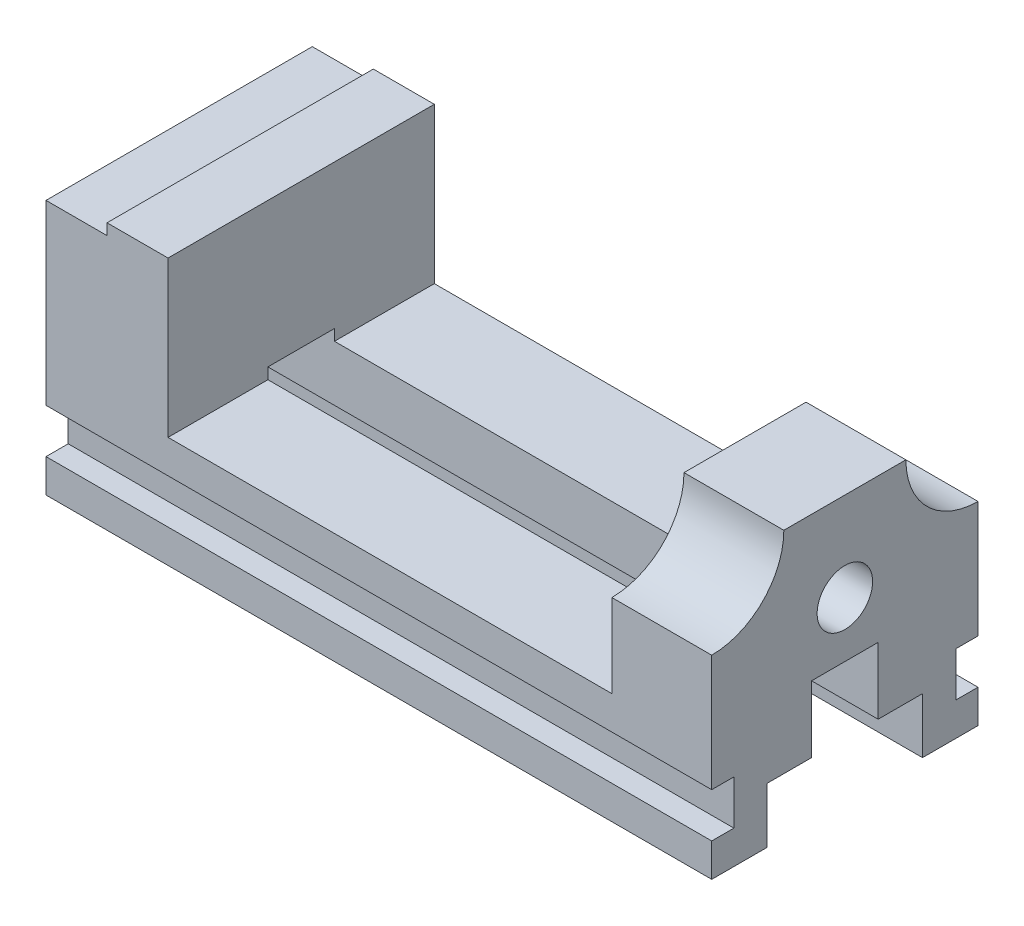
ISO-10303-21;
HEADER;
FILE_DESCRIPTION(('STEP AP214'),'2;1');
FILE_NAME('part.step','',(''),(''),'','','');
FILE_SCHEMA(('AUTOMOTIVE_DESIGN { 1 0 10303 214 1 1 1 1 }'));
ENDSEC;
DATA;
#1=APPLICATION_CONTEXT('core data for automotive mechanical design processes');
#2=APPLICATION_PROTOCOL_DEFINITION('international standard','automotive_design',2000,#1);
#3=PRODUCT_CONTEXT('',#1,'mechanical');
#4=PRODUCT('Part','Part','',(#3));
#5=PRODUCT_RELATED_PRODUCT_CATEGORY('part','',(#4));
#6=PRODUCT_DEFINITION_FORMATION('','',#4);
#7=PRODUCT_DEFINITION_CONTEXT('part definition',#1,'design');
#8=PRODUCT_DEFINITION('design','',#6,#7);
#9=PRODUCT_DEFINITION_SHAPE('','',#8);
#10=(LENGTH_UNIT() NAMED_UNIT(*) SI_UNIT(.MILLI.,.METRE.));
#11=(NAMED_UNIT(*) PLANE_ANGLE_UNIT() SI_UNIT($,.RADIAN.));
#12=(NAMED_UNIT(*) SI_UNIT($,.STERADIAN.) SOLID_ANGLE_UNIT());
#13=UNCERTAINTY_MEASURE_WITH_UNIT(LENGTH_MEASURE(1.E-05),#10,'distance_accuracy_value','');
#14=(GEOMETRIC_REPRESENTATION_CONTEXT(3) GLOBAL_UNCERTAINTY_ASSIGNED_CONTEXT((#13)) GLOBAL_UNIT_ASSIGNED_CONTEXT((#10,
#11,#12)) REPRESENTATION_CONTEXT('',''));
#15=CARTESIAN_POINT('',(0.,0.,0.));
#16=DIRECTION('',(0.,0.,1.));
#17=DIRECTION('',(1.,0.,0.));
#18=AXIS2_PLACEMENT_3D('',#15,#16,#17);
#19=CARTESIAN_POINT('',(95.25,-121.629946789616,-76.2));
#20=DIRECTION('',(0.,0.,1.));
#21=DIRECTION('',(1.,0.,0.));
#22=AXIS2_PLACEMENT_3D('',#19,#20,#21);
#23=PLANE('',#22);
#24=DIRECTION('',(0.,-1.,0.));
#25=VECTOR('',#24,1.);
#26=CARTESIAN_POINT('',(0.,-121.629946789616,-76.2));
#27=LINE('',#26,#25);
#28=CARTESIAN_POINT('',(0.,9.525,-76.2));
#29=VERTEX_POINT('',#28);
#30=CARTESIAN_POINT('',(0.,0.,-76.2));
#31=VERTEX_POINT('',#30);
#32=EDGE_CURVE('E407',#29,#31,#27,.T.);
#33=ORIENTED_EDGE('',*,*,#32,.F.);
#34=DIRECTION('',(1.,0.,0.));
#35=VECTOR('',#34,1.);
#36=CARTESIAN_POINT('',(95.25,9.52500000000001,-76.2));
#37=LINE('',#36,#35);
#38=CARTESIAN_POINT('',(190.5,9.525,-76.2));
#39=VERTEX_POINT('',#38);
#40=EDGE_CURVE('E11',#29,#39,#37,.T.);
#41=ORIENTED_EDGE('',*,*,#40,.T.);
#42=DIRECTION('',(0.,1.,0.));
#43=VECTOR('',#42,1.);
#44=CARTESIAN_POINT('',(190.5,-121.629946789616,-76.2));
#45=LINE('',#44,#43);
#46=CARTESIAN_POINT('',(190.5,0.,-76.2));
#47=VERTEX_POINT('',#46);
#48=EDGE_CURVE('E413',#47,#39,#45,.T.);
#49=ORIENTED_EDGE('',*,*,#48,.F.);
#50=DIRECTION('',(1.,0.,0.));
#51=VECTOR('',#50,1.);
#52=CARTESIAN_POINT('',(95.25,0.,-76.2));
#53=LINE('',#52,#51);
#54=EDGE_CURVE('E409',#31,#47,#53,.T.);
#55=ORIENTED_EDGE('',*,*,#54,.F.);
#56=EDGE_LOOP('',(#33,#41,#49,#55));
#57=FACE_BOUND('',#56,.T.);
#58=ADVANCED_FACE('F33',(#57),#23,.F.);
#59=CARTESIAN_POINT('',(95.25,-121.629946789616,0.));
#60=DIRECTION('',(0.,0.,1.));
#61=DIRECTION('',(1.,0.,0.));
#62=AXIS2_PLACEMENT_3D('',#59,#60,#61);
#63=PLANE('',#62);
#64=DIRECTION('',(1.,0.,0.));
#65=VECTOR('',#64,1.);
#66=CARTESIAN_POINT('',(95.25,9.52500000000001,0.));
#67=LINE('',#66,#65);
#68=CARTESIAN_POINT('',(0.,9.525,0.));
#69=VERTEX_POINT('',#68);
#70=CARTESIAN_POINT('',(190.5,9.525,0.));
#71=VERTEX_POINT('',#70);
#72=EDGE_CURVE('E484',#69,#71,#67,.T.);
#73=ORIENTED_EDGE('',*,*,#72,.F.);
#74=DIRECTION('',(0.,-1.,0.));
#75=VECTOR('',#74,1.);
#76=CARTESIAN_POINT('',(0.,-121.629946789616,0.));
#77=LINE('',#76,#75);
#78=CARTESIAN_POINT('',(0.,0.,0.));
#79=VERTEX_POINT('',#78);
#80=EDGE_CURVE('E433',#69,#79,#77,.T.);
#81=ORIENTED_EDGE('',*,*,#80,.T.);
#82=DIRECTION('',(1.,0.,0.));
#83=VECTOR('',#82,1.);
#84=CARTESIAN_POINT('',(95.25,0.,0.));
#85=LINE('',#84,#83);
#86=CARTESIAN_POINT('',(190.5,0.,0.));
#87=VERTEX_POINT('',#86);
#88=EDGE_CURVE('E437',#79,#87,#85,.T.);
#89=ORIENTED_EDGE('',*,*,#88,.T.);
#90=DIRECTION('',(0.,1.,0.));
#91=VECTOR('',#90,1.);
#92=CARTESIAN_POINT('',(190.5,-121.629946789616,0.));
#93=LINE('',#92,#91);
#94=EDGE_CURVE('E441',#87,#71,#93,.T.);
#95=ORIENTED_EDGE('',*,*,#94,.T.);
#96=EDGE_LOOP('',(#73,#81,#89,#95));
#97=FACE_BOUND('',#96,.T.);
#98=ADVANCED_FACE('F544',(#97),#63,.T.);
#99=CARTESIAN_POINT('',(95.25,31.75,-76.2));
#100=DIRECTION('',(0.,1.,0.));
#101=DIRECTION('',(-1.,0.,0.));
#102=AXIS2_PLACEMENT_3D('',#99,#100,#101);
#103=PLANE('',#102);
#104=DIRECTION('',(1.,0.,0.));
#105=VECTOR('',#104,1.);
#106=CARTESIAN_POINT('',(95.25,31.75,-28.575));
#107=LINE('',#106,#105);
#108=CARTESIAN_POINT('',(34.925,31.75,-28.575));
#109=VERTEX_POINT('',#108);
#110=CARTESIAN_POINT('',(161.925,31.75,-28.575));
#111=VERTEX_POINT('',#110);
#112=EDGE_CURVE('E366',#109,#111,#107,.T.);
#113=ORIENTED_EDGE('',*,*,#112,.F.);
#114=DIRECTION('',(0.,0.,1.));
#115=VECTOR('',#114,1.);
#116=CARTESIAN_POINT('',(34.925,31.75,-76.2));
#117=LINE('',#116,#115);
#118=CARTESIAN_POINT('',(34.925,31.75,0.));
#119=VERTEX_POINT('',#118);
#120=EDGE_CURVE('E463',#109,#119,#117,.T.);
#121=ORIENTED_EDGE('',*,*,#120,.T.);
#122=DIRECTION('',(-1.,0.,0.));
#123=VECTOR('',#122,1.);
#124=CARTESIAN_POINT('',(95.25,31.75,0.));
#125=LINE('',#124,#123);
#126=CARTESIAN_POINT('',(161.925,31.75,0.));
#127=VERTEX_POINT('',#126);
#128=EDGE_CURVE('E447',#127,#119,#125,.T.);
#129=ORIENTED_EDGE('',*,*,#128,.F.);
#130=DIRECTION('',(0.,0.,1.));
#131=VECTOR('',#130,1.);
#132=CARTESIAN_POINT('',(161.925,31.75,-76.2));
#133=LINE('',#132,#131);
#134=EDGE_CURVE('E467',#111,#127,#133,.T.);
#135=ORIENTED_EDGE('',*,*,#134,.F.);
#136=EDGE_LOOP('',(#113,#121,#129,#135));
#137=FACE_BOUND('',#136,.T.);
#138=ADVANCED_FACE('F598',(#137),#103,.T.);
#139=CARTESIAN_POINT('',(95.25,0.,-76.2));
#140=DIRECTION('',(0.,-1.,0.));
#141=DIRECTION('',(0.,0.,-1.));
#142=AXIS2_PLACEMENT_3D('',#139,#140,#141);
#143=PLANE('',#142);
#144=DIRECTION('',(1.,0.,0.));
#145=VECTOR('',#144,1.);
#146=CARTESIAN_POINT('',(0.,0.,-60.325));
#147=LINE('',#146,#145);
#148=CARTESIAN_POINT('',(0.,0.,-60.325));
#149=VERTEX_POINT('',#148);
#150=CARTESIAN_POINT('',(190.5,0.,-60.325));
#151=VERTEX_POINT('',#150);
#152=EDGE_CURVE('E333',#149,#151,#147,.T.);
#153=ORIENTED_EDGE('',*,*,#152,.F.);
#154=DIRECTION('',(0.,0.,1.));
#155=VECTOR('',#154,1.);
#156=CARTESIAN_POINT('',(0.,0.,-76.2));
#157=LINE('',#156,#155);
#158=EDGE_CURVE('E476',#31,#149,#157,.T.);
#159=ORIENTED_EDGE('',*,*,#158,.F.);
#160=ORIENTED_EDGE('',*,*,#54,.T.);
#161=DIRECTION('',(0.,0.,1.));
#162=VECTOR('',#161,1.);
#163=CARTESIAN_POINT('',(190.5,0.,-76.2));
#164=LINE('',#163,#162);
#165=EDGE_CURVE('E472',#47,#151,#164,.T.);
#166=ORIENTED_EDGE('',*,*,#165,.T.);
#167=EDGE_LOOP('',(#153,#159,#160,#166));
#168=FACE_BOUND('',#167,.T.);
#169=ADVANCED_FACE('F503',(#168),#143,.T.);
#170=CARTESIAN_POINT('',(17.4625,-121.629946789616,-76.2));
#171=DIRECTION('',(-1.,0.,0.));
#172=DIRECTION('',(0.,0.,1.));
#173=AXIS2_PLACEMENT_3D('',#170,#171,#172);
#174=PLANE('',#173);
#175=DIRECTION('',(0.,-1.,0.));
#176=VECTOR('',#175,1.);
#177=CARTESIAN_POINT('',(17.4625,-121.629946789616,0.));
#178=LINE('',#177,#176);
#179=CARTESIAN_POINT('',(17.4625,76.2,0.));
#180=VERTEX_POINT('',#179);
#181=CARTESIAN_POINT('',(17.4625,73.025,0.));
#182=VERTEX_POINT('',#181);
#183=EDGE_CURVE('E397',#180,#182,#178,.T.);
#184=ORIENTED_EDGE('',*,*,#183,.F.);
#185=DIRECTION('',(0.,0.,1.));
#186=VECTOR('',#185,1.);
#187=CARTESIAN_POINT('',(17.4625,76.2,-76.2));
#188=LINE('',#187,#186);
#189=CARTESIAN_POINT('',(17.4625,76.2,-76.2));
#190=VERTEX_POINT('',#189);
#191=EDGE_CURVE('E455',#190,#180,#188,.T.);
#192=ORIENTED_EDGE('',*,*,#191,.F.);
#193=DIRECTION('',(0.,-1.,0.));
#194=VECTOR('',#193,1.);
#195=CARTESIAN_POINT('',(17.4625,-121.629946789616,-76.2));
#196=LINE('',#195,#194);
#197=CARTESIAN_POINT('',(17.4625,73.025,-76.2));
#198=VERTEX_POINT('',#197);
#199=EDGE_CURVE('E400',#190,#198,#196,.T.);
#200=ORIENTED_EDGE('',*,*,#199,.T.);
#201=DIRECTION('',(0.,0.,1.));
#202=VECTOR('',#201,1.);
#203=CARTESIAN_POINT('',(17.4625,73.025,-76.2));
#204=LINE('',#203,#202);
#205=EDGE_CURVE('E427',#198,#182,#204,.T.);
#206=ORIENTED_EDGE('',*,*,#205,.T.);
#207=EDGE_LOOP('',(#184,#192,#200,#206));
#208=FACE_BOUND('',#207,.T.);
#209=ADVANCED_FACE('F35',(#208),#174,.T.);
#210=CARTESIAN_POINT('',(95.25,76.2,-76.2));
#211=DIRECTION('',(0.,1.,0.));
#212=DIRECTION('',(0.,0.,1.));
#213=AXIS2_PLACEMENT_3D('',#210,#211,#212);
#214=PLANE('',#213);
#215=DIRECTION('',(-1.,0.,0.));
#216=VECTOR('',#215,1.);
#217=CARTESIAN_POINT('',(95.25,76.2,0.));
#218=LINE('',#217,#216);
#219=CARTESIAN_POINT('',(34.925,76.2,0.));
#220=VERTEX_POINT('',#219);
#221=EDGE_CURVE('E404',#220,#180,#218,.T.);
#222=ORIENTED_EDGE('',*,*,#221,.F.);
#223=DIRECTION('',(0.,0.,1.));
#224=VECTOR('',#223,1.);
#225=CARTESIAN_POINT('',(34.925,76.2,-76.2));
#226=LINE('',#225,#224);
#227=CARTESIAN_POINT('',(34.925,76.2,-76.2));
#228=VERTEX_POINT('',#227);
#229=EDGE_CURVE('E458',#228,#220,#226,.T.);
#230=ORIENTED_EDGE('',*,*,#229,.F.);
#231=DIRECTION('',(-1.,0.,0.));
#232=VECTOR('',#231,1.);
#233=CARTESIAN_POINT('',(95.25,76.2,-76.2));
#234=LINE('',#233,#232);
#235=EDGE_CURVE('E424',#228,#190,#234,.T.);
#236=ORIENTED_EDGE('',*,*,#235,.T.);
#237=ORIENTED_EDGE('',*,*,#191,.T.);
#238=EDGE_LOOP('',(#222,#230,#236,#237));
#239=FACE_BOUND('',#238,.T.);
#240=ADVANCED_FACE('F566',(#239),#214,.T.);
#241=CARTESIAN_POINT('',(34.925,-121.629946789616,-76.2));
#242=DIRECTION('',(1.,0.,0.));
#243=DIRECTION('',(0.,0.,-1.));
#244=AXIS2_PLACEMENT_3D('',#241,#242,#243);
#245=PLANE('',#244);
#246=DIRECTION('',(0.,-1.,0.));
#247=VECTOR('',#246,1.);
#248=CARTESIAN_POINT('',(34.925,-121.629946789616,-28.575));
#249=LINE('',#248,#247);
#250=CARTESIAN_POINT('',(34.925,34.925,-28.575));
#251=VERTEX_POINT('',#250);
#252=EDGE_CURVE('E368',#251,#109,#249,.T.);
#253=ORIENTED_EDGE('',*,*,#252,.F.);
#254=DIRECTION('',(0.,0.,1.));
#255=VECTOR('',#254,1.);
#256=CARTESIAN_POINT('',(34.925,34.925,-76.2));
#257=LINE('',#256,#255);
#258=CARTESIAN_POINT('',(34.925,34.925,-47.625));
#259=VERTEX_POINT('',#258);
#260=EDGE_CURVE('E362',#259,#251,#257,.T.);
#261=ORIENTED_EDGE('',*,*,#260,.F.);
#262=DIRECTION('',(0.,1.,0.));
#263=VECTOR('',#262,1.);
#264=CARTESIAN_POINT('',(34.925,-121.629946789616,-47.625));
#265=LINE('',#264,#263);
#266=CARTESIAN_POINT('',(34.925,31.75,-47.625));
#267=VERTEX_POINT('',#266);
#268=EDGE_CURVE('E357',#267,#259,#265,.T.);
#269=ORIENTED_EDGE('',*,*,#268,.F.);
#270=CARTESIAN_POINT('',(34.925,31.75,-76.2));
#271=VERTEX_POINT('',#270);
#272=EDGE_CURVE('E460',#271,#267,#117,.T.);
#273=ORIENTED_EDGE('',*,*,#272,.F.);
#274=DIRECTION('',(0.,1.,0.));
#275=VECTOR('',#274,1.);
#276=CARTESIAN_POINT('',(34.925,-121.629946789616,-76.2));
#277=LINE('',#276,#275);
#278=EDGE_CURVE('E421',#271,#228,#277,.T.);
#279=ORIENTED_EDGE('',*,*,#278,.T.);
#280=ORIENTED_EDGE('',*,*,#229,.T.);
#281=DIRECTION('',(0.,1.,0.));
#282=VECTOR('',#281,1.);
#283=CARTESIAN_POINT('',(34.925,-121.629946789616,0.));
#284=LINE('',#283,#282);
#285=EDGE_CURVE('E450',#119,#220,#284,.T.);
#286=ORIENTED_EDGE('',*,*,#285,.F.);
#287=ORIENTED_EDGE('',*,*,#120,.F.);
#288=EDGE_LOOP('',(#253,#261,#269,#273,#279,#280,#286,#287));
#289=FACE_BOUND('',#288,.T.);
#290=ADVANCED_FACE('F601',(#289),#245,.T.);
#291=DIRECTION('',(-1.,0.,0.));
#292=VECTOR('',#291,1.);
#293=CARTESIAN_POINT('',(95.25,31.75,-47.625));
#294=LINE('',#293,#292);
#295=CARTESIAN_POINT('',(161.925,31.75,-47.625));
#296=VERTEX_POINT('',#295);
#297=EDGE_CURVE('E355',#296,#267,#294,.T.);
#298=ORIENTED_EDGE('',*,*,#297,.F.);
#299=CARTESIAN_POINT('',(161.925,31.75,-76.2));
#300=VERTEX_POINT('',#299);
#301=EDGE_CURVE('E464',#300,#296,#133,.T.);
#302=ORIENTED_EDGE('',*,*,#301,.F.);
#303=DIRECTION('',(-1.,0.,0.));
#304=VECTOR('',#303,1.);
#305=CARTESIAN_POINT('',(95.25,31.75,-76.2));
#306=LINE('',#305,#304);
#307=EDGE_CURVE('E418',#300,#271,#306,.T.);
#308=ORIENTED_EDGE('',*,*,#307,.T.);
#309=ORIENTED_EDGE('',*,*,#272,.T.);
#310=EDGE_LOOP('',(#298,#302,#308,#309));
#311=FACE_BOUND('',#310,.T.);
#312=ADVANCED_FACE('F574',(#311),#103,.T.);
#313=CARTESIAN_POINT('',(161.925,-121.629946789616,-76.2));
#314=DIRECTION('',(-1.,0.,0.));
#315=DIRECTION('',(0.,0.,1.));
#316=AXIS2_PLACEMENT_3D('',#313,#314,#315);
#317=PLANE('',#316);
#318=DIRECTION('',(0.,1.,0.));
#319=VECTOR('',#318,1.);
#320=CARTESIAN_POINT('',(161.925,-121.629946789616,-28.575));
#321=LINE('',#320,#319);
#322=CARTESIAN_POINT('',(161.925,34.925,-28.575));
#323=VERTEX_POINT('',#322);
#324=EDGE_CURVE('E364',#111,#323,#321,.T.);
#325=ORIENTED_EDGE('',*,*,#324,.F.);
#326=ORIENTED_EDGE('',*,*,#134,.T.);
#327=DIRECTION('',(0.,-1.,0.));
#328=VECTOR('',#327,1.);
#329=CARTESIAN_POINT('',(161.925,-121.629946789616,0.));
#330=LINE('',#329,#328);
#331=CARTESIAN_POINT('',(161.925,55.5625,0.));
#332=VERTEX_POINT('',#331);
#333=EDGE_CURVE('E444',#332,#127,#330,.T.);
#334=ORIENTED_EDGE('',*,*,#333,.F.);
#335=CARTESIAN_POINT('',(161.925,76.2,0.));
#336=DIRECTION('',(1.,0.,0.));
#337=DIRECTION('',(0.,0.,-1.));
#338=AXIS2_PLACEMENT_3D('',#335,#336,#337);
#339=CIRCLE('',#338,20.6375);
#340=CARTESIAN_POINT('',(161.925,76.2,-20.6375));
#341=VERTEX_POINT('',#340);
#342=EDGE_CURVE('E388',#332,#341,#339,.T.);
#343=ORIENTED_EDGE('',*,*,#342,.T.);
#344=DIRECTION('',(0.,0.,1.));
#345=VECTOR('',#344,1.);
#346=CARTESIAN_POINT('',(161.925,76.2,-76.2));
#347=LINE('',#346,#345);
#348=CARTESIAN_POINT('',(161.925,76.2,-55.5625));
#349=VERTEX_POINT('',#348);
#350=EDGE_CURVE('E468',#349,#341,#347,.T.);
#351=ORIENTED_EDGE('',*,*,#350,.F.);
#352=CARTESIAN_POINT('',(161.925,76.2,-76.2));
#353=DIRECTION('',(1.,0.,0.));
#354=DIRECTION('',(0.,0.,-1.));
#355=AXIS2_PLACEMENT_3D('',#352,#353,#354);
#356=CIRCLE('',#355,20.6375);
#357=CARTESIAN_POINT('',(161.925,55.5625,-76.2));
#358=VERTEX_POINT('',#357);
#359=EDGE_CURVE('E377',#349,#358,#356,.T.);
#360=ORIENTED_EDGE('',*,*,#359,.T.);
#361=DIRECTION('',(0.,-1.,0.));
#362=VECTOR('',#361,1.);
#363=CARTESIAN_POINT('',(161.925,-121.629946789616,-76.2));
#364=LINE('',#363,#362);
#365=EDGE_CURVE('E416',#358,#300,#364,.T.);
#366=ORIENTED_EDGE('',*,*,#365,.T.);
#367=ORIENTED_EDGE('',*,*,#301,.T.);
#368=DIRECTION('',(0.,-1.,0.));
#369=VECTOR('',#368,1.);
#370=CARTESIAN_POINT('',(161.925,-121.629946789616,-47.625));
#371=LINE('',#370,#369);
#372=CARTESIAN_POINT('',(161.925,34.925,-47.625));
#373=VERTEX_POINT('',#372);
#374=EDGE_CURVE('E335',#373,#296,#371,.T.);
#375=ORIENTED_EDGE('',*,*,#374,.F.);
#376=DIRECTION('',(0.,0.,-1.));
#377=VECTOR('',#376,1.);
#378=CARTESIAN_POINT('',(161.925,34.925,-76.2));
#379=LINE('',#378,#377);
#380=EDGE_CURVE('E359',#323,#373,#379,.T.);
#381=ORIENTED_EDGE('',*,*,#380,.F.);
#382=EDGE_LOOP('',(#325,#326,#334,#343,#351,#360,#366,#367,#375,#381));
#383=FACE_BOUND('',#382,.T.);
#384=CARTESIAN_POINT('',(161.925,50.8,-38.1));
#385=DIRECTION('',(-1.,0.,0.));
#386=DIRECTION('',(0.,0.,1.));
#387=AXIS2_PLACEMENT_3D('',#384,#385,#386);
#388=CIRCLE('',#387,7.9375);
#389=CARTESIAN_POINT('',(161.925,50.8,-46.0375));
#390=VERTEX_POINT('',#389);
#391=EDGE_CURVE('E373',#390,#390,#388,.T.);
#392=ORIENTED_EDGE('',*,*,#391,.F.);
#393=EDGE_LOOP('',(#392));
#394=FACE_BOUND('',#393,.T.);
#395=ADVANCED_FACE('F578',(#383,#394),#317,.T.);
#396=CARTESIAN_POINT('',(95.25,76.2,-76.2));
#397=DIRECTION('',(0.,1.,0.));
#398=DIRECTION('',(0.,0.,1.));
#399=AXIS2_PLACEMENT_3D('',#396,#397,#398);
#400=PLANE('',#399);
#401=DIRECTION('',(1.,0.,0.));
#402=VECTOR('',#401,1.);
#403=CARTESIAN_POINT('',(161.925,76.2,-55.5625));
#404=LINE('',#403,#402);
#405=CARTESIAN_POINT('',(190.5,76.2,-55.5625));
#406=VERTEX_POINT('',#405);
#407=EDGE_CURVE('E380',#349,#406,#404,.T.);
#408=ORIENTED_EDGE('',*,*,#407,.F.);
#409=ORIENTED_EDGE('',*,*,#350,.T.);
#410=DIRECTION('',(1.,0.,0.));
#411=VECTOR('',#410,1.);
#412=CARTESIAN_POINT('',(161.925,76.2,-20.6375));
#413=LINE('',#412,#411);
#414=CARTESIAN_POINT('',(190.5,76.2,-20.6375));
#415=VERTEX_POINT('',#414);
#416=EDGE_CURVE('E394',#341,#415,#413,.T.);
#417=ORIENTED_EDGE('',*,*,#416,.T.);
#418=DIRECTION('',(0.,0.,1.));
#419=VECTOR('',#418,1.);
#420=CARTESIAN_POINT('',(190.5,76.2,-76.2));
#421=LINE('',#420,#419);
#422=EDGE_CURVE('E470',#406,#415,#421,.T.);
#423=ORIENTED_EDGE('',*,*,#422,.F.);
#424=EDGE_LOOP('',(#408,#409,#417,#423));
#425=FACE_BOUND('',#424,.T.);
#426=ADVANCED_FACE('F588',(#425),#400,.T.);
#427=CARTESIAN_POINT('',(190.5,-121.629946789616,-76.2));
#428=DIRECTION('',(1.,0.,0.));
#429=DIRECTION('',(0.,0.,-1.));
#430=AXIS2_PLACEMENT_3D('',#427,#428,#429);
#431=PLANE('',#430);
#432=DIRECTION('',(0.,0.,-1.));
#433=VECTOR('',#432,1.);
#434=CARTESIAN_POINT('',(190.5,9.525,-82.55));
#435=LINE('',#434,#433);
#436=CARTESIAN_POINT('',(190.5,9.525,-69.85));
#437=VERTEX_POINT('',#436);
#438=EDGE_CURVE('E266',#437,#39,#435,.T.);
#439=ORIENTED_EDGE('',*,*,#438,.F.);
#440=DIRECTION('',(0.,-1.,0.));
#441=VECTOR('',#440,1.);
#442=CARTESIAN_POINT('',(190.5,9.525,-69.85));
#443=LINE('',#442,#441);
#444=CARTESIAN_POINT('',(190.5,22.225,-69.85));
#445=VERTEX_POINT('',#444);
#446=EDGE_CURVE('E263',#445,#437,#443,.T.);
#447=ORIENTED_EDGE('',*,*,#446,.F.);
#448=DIRECTION('',(0.,0.,1.));
#449=VECTOR('',#448,1.);
#450=CARTESIAN_POINT('',(190.5,22.225,-82.55));
#451=LINE('',#450,#449);
#452=CARTESIAN_POINT('',(190.5,22.225,-76.2));
#453=VERTEX_POINT('',#452);
#454=EDGE_CURVE('E244',#453,#445,#451,.T.);
#455=ORIENTED_EDGE('',*,*,#454,.F.);
#456=CARTESIAN_POINT('',(190.5,55.5625,-76.2));
#457=VERTEX_POINT('',#456);
#458=EDGE_CURVE('E412',#453,#457,#45,.T.);
#459=ORIENTED_EDGE('',*,*,#458,.T.);
#460=CARTESIAN_POINT('',(190.5,76.2,-76.2));
#461=DIRECTION('',(1.,0.,0.));
#462=DIRECTION('',(0.,0.,-1.));
#463=AXIS2_PLACEMENT_3D('',#460,#461,#462);
#464=CIRCLE('',#463,20.6375);
#465=EDGE_CURVE('E376',#406,#457,#464,.T.);
#466=ORIENTED_EDGE('',*,*,#465,.F.);
#467=ORIENTED_EDGE('',*,*,#422,.T.);
#468=CARTESIAN_POINT('',(190.5,76.2,0.));
#469=DIRECTION('',(1.,0.,0.));
#470=DIRECTION('',(0.,0.,-1.));
#471=AXIS2_PLACEMENT_3D('',#468,#469,#470);
#472=CIRCLE('',#471,20.6375);
#473=CARTESIAN_POINT('',(190.5,55.5625,0.));
#474=VERTEX_POINT('',#473);
#475=EDGE_CURVE('E386',#474,#415,#472,.T.);
#476=ORIENTED_EDGE('',*,*,#475,.F.);
#477=CARTESIAN_POINT('',(190.5,22.225,0.));
#478=VERTEX_POINT('',#477);
#479=EDGE_CURVE('E440',#478,#474,#93,.T.);
#480=ORIENTED_EDGE('',*,*,#479,.F.);
#481=DIRECTION('',(0.,0.,1.));
#482=VECTOR('',#481,1.);
#483=CARTESIAN_POINT('',(190.5,22.225,6.35));
#484=LINE('',#483,#482);
#485=CARTESIAN_POINT('',(190.5,22.225,-6.35));
#486=VERTEX_POINT('',#485);
#487=EDGE_CURVE('E56',#486,#478,#484,.T.);
#488=ORIENTED_EDGE('',*,*,#487,.F.);
#489=DIRECTION('',(0.,1.,0.));
#490=VECTOR('',#489,1.);
#491=CARTESIAN_POINT('',(190.5,9.525,-6.35));
#492=LINE('',#491,#490);
#493=CARTESIAN_POINT('',(190.5,9.525,-6.35));
#494=VERTEX_POINT('',#493);
#495=EDGE_CURVE('E270',#494,#486,#492,.T.);
#496=ORIENTED_EDGE('',*,*,#495,.F.);
#497=DIRECTION('',(0.,0.,-1.));
#498=VECTOR('',#497,1.);
#499=CARTESIAN_POINT('',(190.5,9.525,6.35));
#500=LINE('',#499,#498);
#501=EDGE_CURVE('E276',#71,#494,#500,.T.);
#502=ORIENTED_EDGE('',*,*,#501,.F.);
#503=ORIENTED_EDGE('',*,*,#94,.F.);
#504=CARTESIAN_POINT('',(190.5,0.,-15.875));
#505=VERTEX_POINT('',#504);
#506=EDGE_CURVE('E475',#505,#87,#164,.T.);
#507=ORIENTED_EDGE('',*,*,#506,.F.);
#508=DIRECTION('',(0.,-1.,0.));
#509=VECTOR('',#508,1.);
#510=CARTESIAN_POINT('',(190.5,15.875,-15.875));
#511=LINE('',#510,#509);
#512=CARTESIAN_POINT('',(190.5,15.875,-15.875));
#513=VERTEX_POINT('',#512);
#514=EDGE_CURVE('E296',#513,#505,#511,.T.);
#515=ORIENTED_EDGE('',*,*,#514,.F.);
#516=DIRECTION('',(0.,0.,1.));
#517=VECTOR('',#516,1.);
#518=CARTESIAN_POINT('',(190.5,15.875,-15.875));
#519=LINE('',#518,#517);
#520=CARTESIAN_POINT('',(190.5,15.875,-28.575));
#521=VERTEX_POINT('',#520);
#522=EDGE_CURVE('E329',#521,#513,#519,.T.);
#523=ORIENTED_EDGE('',*,*,#522,.F.);
#524=DIRECTION('',(0.,-1.,0.));
#525=VECTOR('',#524,1.);
#526=CARTESIAN_POINT('',(190.5,34.925,-28.575));
#527=LINE('',#526,#525);
#528=CARTESIAN_POINT('',(190.5,34.925,-28.575));
#529=VERTEX_POINT('',#528);
#530=EDGE_CURVE('E326',#529,#521,#527,.T.);
#531=ORIENTED_EDGE('',*,*,#530,.F.);
#532=DIRECTION('',(0.,0.,1.));
#533=VECTOR('',#532,1.);
#534=CARTESIAN_POINT('',(190.5,34.925,-28.575));
#535=LINE('',#534,#533);
#536=CARTESIAN_POINT('',(190.5,34.925,-47.625));
#537=VERTEX_POINT('',#536);
#538=EDGE_CURVE('E323',#537,#529,#535,.T.);
#539=ORIENTED_EDGE('',*,*,#538,.F.);
#540=DIRECTION('',(0.,1.,0.));
#541=VECTOR('',#540,1.);
#542=CARTESIAN_POINT('',(190.5,34.925,-47.625));
#543=LINE('',#542,#541);
#544=CARTESIAN_POINT('',(190.5,15.875,-47.625));
#545=VERTEX_POINT('',#544);
#546=EDGE_CURVE('E320',#545,#537,#543,.T.);
#547=ORIENTED_EDGE('',*,*,#546,.F.);
#548=DIRECTION('',(0.,0.,1.));
#549=VECTOR('',#548,1.);
#550=CARTESIAN_POINT('',(190.5,15.875,-47.625));
#551=LINE('',#550,#549);
#552=CARTESIAN_POINT('',(190.5,15.875,-60.325));
#553=VERTEX_POINT('',#552);
#554=EDGE_CURVE('E317',#553,#545,#551,.T.);
#555=ORIENTED_EDGE('',*,*,#554,.F.);
#556=DIRECTION('',(0.,1.,0.));
#557=VECTOR('',#556,1.);
#558=CARTESIAN_POINT('',(190.5,15.875,-60.325));
#559=LINE('',#558,#557);
#560=EDGE_CURVE('E290',#151,#553,#559,.T.);
#561=ORIENTED_EDGE('',*,*,#560,.F.);
#562=ORIENTED_EDGE('',*,*,#165,.F.);
#563=ORIENTED_EDGE('',*,*,#48,.T.);
#564=EDGE_LOOP('',(#439,#447,#455,#459,#466,#467,#476,#480,#488,#496,#502,#503,#507,#515,#523,
#531,#539,#547,#555,#561,#562,#563));
#565=FACE_BOUND('',#564,.T.);
#566=CARTESIAN_POINT('',(190.5,50.8,-38.1));
#567=DIRECTION('',(1.,0.,0.));
#568=DIRECTION('',(0.,0.,-1.));
#569=AXIS2_PLACEMENT_3D('',#566,#567,#568);
#570=CIRCLE('',#569,7.9375);
#571=CARTESIAN_POINT('',(190.5,50.8,-46.0375));
#572=VERTEX_POINT('',#571);
#573=EDGE_CURVE('E370',#572,#572,#570,.T.);
#574=ORIENTED_EDGE('',*,*,#573,.F.);
#575=EDGE_LOOP('',(#574));
#576=FACE_BOUND('',#575,.T.);
#577=ADVANCED_FACE('F491',(#565,#576),#431,.T.);
#578=DIRECTION('',(1.,0.,0.));
#579=VECTOR('',#578,1.);
#580=CARTESIAN_POINT('',(0.,0.,-15.875));
#581=LINE('',#580,#579);
#582=CARTESIAN_POINT('',(0.,0.,-15.875));
#583=VERTEX_POINT('',#582);
#584=EDGE_CURVE('E336',#583,#505,#581,.T.);
#585=ORIENTED_EDGE('',*,*,#584,.T.);
#586=ORIENTED_EDGE('',*,*,#506,.T.);
#587=ORIENTED_EDGE('',*,*,#88,.F.);
#588=EDGE_CURVE('E479',#583,#79,#157,.T.);
#589=ORIENTED_EDGE('',*,*,#588,.F.);
#590=EDGE_LOOP('',(#585,#586,#587,#589));
#591=FACE_BOUND('',#590,.T.);
#592=ADVANCED_FACE('F537',(#591),#143,.T.);
#593=CARTESIAN_POINT('',(0.,-121.629946789616,-76.2));
#594=DIRECTION('',(-1.,0.,0.));
#595=DIRECTION('',(0.,0.,1.));
#596=AXIS2_PLACEMENT_3D('',#593,#594,#595);
#597=PLANE('',#596);
#598=DIRECTION('',(0.,0.,-1.));
#599=VECTOR('',#598,1.);
#600=CARTESIAN_POINT('',(0.,9.525,-82.55));
#601=LINE('',#600,#599);
#602=CARTESIAN_POINT('',(0.,9.525,-69.85));
#603=VERTEX_POINT('',#602);
#604=EDGE_CURVE('E261',#603,#29,#601,.T.);
#605=ORIENTED_EDGE('',*,*,#604,.T.);
#606=ORIENTED_EDGE('',*,*,#32,.T.);
#607=ORIENTED_EDGE('',*,*,#158,.T.);
#608=DIRECTION('',(0.,1.,0.));
#609=VECTOR('',#608,1.);
#610=CARTESIAN_POINT('',(0.,15.875,-60.325));
#611=LINE('',#610,#609);
#612=CARTESIAN_POINT('',(0.,15.875,-60.325));
#613=VERTEX_POINT('',#612);
#614=EDGE_CURVE('E292',#149,#613,#611,.T.);
#615=ORIENTED_EDGE('',*,*,#614,.T.);
#616=DIRECTION('',(0.,0.,1.));
#617=VECTOR('',#616,1.);
#618=CARTESIAN_POINT('',(0.,15.875,-47.625));
#619=LINE('',#618,#617);
#620=CARTESIAN_POINT('',(0.,15.875,-47.625));
#621=VERTEX_POINT('',#620);
#622=EDGE_CURVE('E295',#613,#621,#619,.T.);
#623=ORIENTED_EDGE('',*,*,#622,.T.);
#624=DIRECTION('',(0.,1.,0.));
#625=VECTOR('',#624,1.);
#626=CARTESIAN_POINT('',(0.,34.925,-47.625));
#627=LINE('',#626,#625);
#628=CARTESIAN_POINT('',(0.,34.925,-47.625));
#629=VERTEX_POINT('',#628);
#630=EDGE_CURVE('E299',#621,#629,#627,.T.);
#631=ORIENTED_EDGE('',*,*,#630,.T.);
#632=DIRECTION('',(0.,0.,1.));
#633=VECTOR('',#632,1.);
#634=CARTESIAN_POINT('',(0.,34.925,-28.575));
#635=LINE('',#634,#633);
#636=CARTESIAN_POINT('',(0.,34.925,-28.575));
#637=VERTEX_POINT('',#636);
#638=EDGE_CURVE('E302',#629,#637,#635,.T.);
#639=ORIENTED_EDGE('',*,*,#638,.T.);
#640=DIRECTION('',(0.,-1.,0.));
#641=VECTOR('',#640,1.);
#642=CARTESIAN_POINT('',(0.,34.925,-28.575));
#643=LINE('',#642,#641);
#644=CARTESIAN_POINT('',(0.,15.875,-28.575));
#645=VERTEX_POINT('',#644);
#646=EDGE_CURVE('E305',#637,#645,#643,.T.);
#647=ORIENTED_EDGE('',*,*,#646,.T.);
#648=DIRECTION('',(0.,0.,1.));
#649=VECTOR('',#648,1.);
#650=CARTESIAN_POINT('',(0.,15.875,-15.875));
#651=LINE('',#650,#649);
#652=CARTESIAN_POINT('',(0.,15.875,-15.875));
#653=VERTEX_POINT('',#652);
#654=EDGE_CURVE('E308',#645,#653,#651,.T.);
#655=ORIENTED_EDGE('',*,*,#654,.T.);
#656=DIRECTION('',(0.,-1.,0.));
#657=VECTOR('',#656,1.);
#658=CARTESIAN_POINT('',(0.,15.875,-15.875));
#659=LINE('',#658,#657);
#660=EDGE_CURVE('E311',#653,#583,#659,.T.);
#661=ORIENTED_EDGE('',*,*,#660,.T.);
#662=ORIENTED_EDGE('',*,*,#588,.T.);
#663=ORIENTED_EDGE('',*,*,#80,.F.);
#664=DIRECTION('',(0.,0.,-1.));
#665=VECTOR('',#664,1.);
#666=CARTESIAN_POINT('',(0.,9.525,6.35));
#667=LINE('',#666,#665);
#668=CARTESIAN_POINT('',(0.,9.525,-6.35));
#669=VERTEX_POINT('',#668);
#670=EDGE_CURVE('E279',#69,#669,#667,.T.);
#671=ORIENTED_EDGE('',*,*,#670,.T.);
#672=DIRECTION('',(0.,1.,0.));
#673=VECTOR('',#672,1.);
#674=CARTESIAN_POINT('',(0.,9.525,-6.35));
#675=LINE('',#674,#673);
#676=CARTESIAN_POINT('',(0.,22.225,-6.35));
#677=VERTEX_POINT('',#676);
#678=EDGE_CURVE('E272',#669,#677,#675,.T.);
#679=ORIENTED_EDGE('',*,*,#678,.T.);
#680=DIRECTION('',(0.,0.,1.));
#681=VECTOR('',#680,1.);
#682=CARTESIAN_POINT('',(0.,22.225,6.35));
#683=LINE('',#682,#681);
#684=CARTESIAN_POINT('',(0.,22.225,0.));
#685=VERTEX_POINT('',#684);
#686=EDGE_CURVE('E275',#677,#685,#683,.T.);
#687=ORIENTED_EDGE('',*,*,#686,.T.);
#688=CARTESIAN_POINT('',(0.,73.025,0.));
#689=VERTEX_POINT('',#688);
#690=EDGE_CURVE('E434',#689,#685,#77,.T.);
#691=ORIENTED_EDGE('',*,*,#690,.F.);
#692=DIRECTION('',(0.,0.,1.));
#693=VECTOR('',#692,1.);
#694=CARTESIAN_POINT('',(0.,73.025,-76.2));
#695=LINE('',#694,#693);
#696=CARTESIAN_POINT('',(0.,73.025,-76.2));
#697=VERTEX_POINT('',#696);
#698=EDGE_CURVE('E480',#697,#689,#695,.T.);
#699=ORIENTED_EDGE('',*,*,#698,.F.);
#700=CARTESIAN_POINT('',(0.,22.225,-76.2));
#701=VERTEX_POINT('',#700);
#702=EDGE_CURVE('E260',#697,#701,#27,.T.);
#703=ORIENTED_EDGE('',*,*,#702,.T.);
#704=DIRECTION('',(0.,0.,1.));
#705=VECTOR('',#704,1.);
#706=CARTESIAN_POINT('',(0.,22.225,-82.55));
#707=LINE('',#706,#705);
#708=CARTESIAN_POINT('',(0.,22.225,-69.85));
#709=VERTEX_POINT('',#708);
#710=EDGE_CURVE('E48',#701,#709,#707,.T.);
#711=ORIENTED_EDGE('',*,*,#710,.T.);
#712=DIRECTION('',(0.,-1.,0.));
#713=VECTOR('',#712,1.);
#714=CARTESIAN_POINT('',(0.,9.525,-69.85));
#715=LINE('',#714,#713);
#716=EDGE_CURVE('E249',#709,#603,#715,.T.);
#717=ORIENTED_EDGE('',*,*,#716,.T.);
#718=EDGE_LOOP('',(#605,#606,#607,#615,#623,#631,#639,#647,#655,#661,#662,#663,#671,#679,#687,
#691,#699,#703,#711,#717));
#719=FACE_BOUND('',#718,.T.);
#720=ADVANCED_FACE('F258',(#719),#597,.T.);
#721=CARTESIAN_POINT('',(95.25,73.025,-76.2));
#722=DIRECTION('',(0.,1.,0.));
#723=DIRECTION('',(0.,0.,1.));
#724=AXIS2_PLACEMENT_3D('',#721,#722,#723);
#725=PLANE('',#724);
#726=DIRECTION('',(-1.,0.,0.));
#727=VECTOR('',#726,1.);
#728=CARTESIAN_POINT('',(95.25,73.025,0.));
#729=LINE('',#728,#727);
#730=EDGE_CURVE('E430',#182,#689,#729,.T.);
#731=ORIENTED_EDGE('',*,*,#730,.F.);
#732=ORIENTED_EDGE('',*,*,#205,.F.);
#733=DIRECTION('',(-1.,0.,0.));
#734=VECTOR('',#733,1.);
#735=CARTESIAN_POINT('',(95.25,73.025,-76.2));
#736=LINE('',#735,#734);
#737=EDGE_CURVE('E403',#198,#697,#736,.T.);
#738=ORIENTED_EDGE('',*,*,#737,.T.);
#739=ORIENTED_EDGE('',*,*,#698,.T.);
#740=EDGE_LOOP('',(#731,#732,#738,#739));
#741=FACE_BOUND('',#740,.T.);
#742=ADVANCED_FACE('F560',(#741),#725,.T.);
#743=ORIENTED_EDGE('',*,*,#458,.F.);
#744=DIRECTION('',(-1.,0.,0.));
#745=VECTOR('',#744,1.);
#746=CARTESIAN_POINT('',(95.25,22.225,-76.2));
#747=LINE('',#746,#745);
#748=EDGE_CURVE('E41',#453,#701,#747,.T.);
#749=ORIENTED_EDGE('',*,*,#748,.T.);
#750=ORIENTED_EDGE('',*,*,#702,.F.);
#751=ORIENTED_EDGE('',*,*,#737,.F.);
#752=ORIENTED_EDGE('',*,*,#199,.F.);
#753=ORIENTED_EDGE('',*,*,#235,.F.);
#754=ORIENTED_EDGE('',*,*,#278,.F.);
#755=ORIENTED_EDGE('',*,*,#307,.F.);
#756=ORIENTED_EDGE('',*,*,#365,.F.);
#757=DIRECTION('',(1.,0.,0.));
#758=VECTOR('',#757,1.);
#759=CARTESIAN_POINT('',(161.925,55.5625,-76.2));
#760=LINE('',#759,#758);
#761=EDGE_CURVE('E383',#358,#457,#760,.T.);
#762=ORIENTED_EDGE('',*,*,#761,.T.);
#763=EDGE_LOOP('',(#743,#749,#750,#751,#752,#753,#754,#755,#756,#762));
#764=FACE_BOUND('',#763,.T.);
#765=ADVANCED_FACE('F487',(#764),#23,.F.);
#766=DIRECTION('',(-1.,0.,0.));
#767=VECTOR('',#766,1.);
#768=CARTESIAN_POINT('',(95.25,22.225,0.));
#769=LINE('',#768,#767);
#770=EDGE_CURVE('E457',#478,#685,#769,.T.);
#771=ORIENTED_EDGE('',*,*,#770,.F.);
#772=ORIENTED_EDGE('',*,*,#479,.T.);
#773=DIRECTION('',(1.,0.,0.));
#774=VECTOR('',#773,1.);
#775=CARTESIAN_POINT('',(161.925,55.5625,0.));
#776=LINE('',#775,#774);
#777=EDGE_CURVE('E391',#332,#474,#776,.T.);
#778=ORIENTED_EDGE('',*,*,#777,.F.);
#779=ORIENTED_EDGE('',*,*,#333,.T.);
#780=ORIENTED_EDGE('',*,*,#128,.T.);
#781=ORIENTED_EDGE('',*,*,#285,.T.);
#782=ORIENTED_EDGE('',*,*,#221,.T.);
#783=ORIENTED_EDGE('',*,*,#183,.T.);
#784=ORIENTED_EDGE('',*,*,#730,.T.);
#785=ORIENTED_EDGE('',*,*,#690,.T.);
#786=EDGE_LOOP('',(#771,#772,#778,#779,#780,#781,#782,#783,#784,#785));
#787=FACE_BOUND('',#786,.T.);
#788=ADVANCED_FACE('F555',(#787),#63,.T.);
#789=CARTESIAN_POINT('',(161.925,76.2,0.));
#790=DIRECTION('',(1.,0.,0.));
#791=DIRECTION('',(0.,0.,-1.));
#792=AXIS2_PLACEMENT_3D('',#789,#790,#791);
#793=CYLINDRICAL_SURFACE('',#792,20.6375);
#794=ORIENTED_EDGE('',*,*,#475,.T.);
#795=ORIENTED_EDGE('',*,*,#416,.F.);
#796=ORIENTED_EDGE('',*,*,#342,.F.);
#797=ORIENTED_EDGE('',*,*,#777,.T.);
#798=EDGE_LOOP('',(#794,#795,#796,#797));
#799=FACE_BOUND('',#798,.T.);
#800=ADVANCED_FACE('F591',(#799),#793,.F.);
#801=CARTESIAN_POINT('',(161.925,76.2,-76.2));
#802=DIRECTION('',(1.,0.,0.));
#803=DIRECTION('',(0.,0.,-1.));
#804=AXIS2_PLACEMENT_3D('',#801,#802,#803);
#805=CYLINDRICAL_SURFACE('',#804,20.6375);
#806=ORIENTED_EDGE('',*,*,#465,.T.);
#807=ORIENTED_EDGE('',*,*,#761,.F.);
#808=ORIENTED_EDGE('',*,*,#359,.F.);
#809=ORIENTED_EDGE('',*,*,#407,.T.);
#810=EDGE_LOOP('',(#806,#807,#808,#809));
#811=FACE_BOUND('',#810,.T.);
#812=ADVANCED_FACE('F583',(#811),#805,.F.);
#813=CARTESIAN_POINT('',(114.3,50.8,-38.1));
#814=DIRECTION('',(1.,0.,0.));
#815=DIRECTION('',(0.,0.,-1.));
#816=AXIS2_PLACEMENT_3D('',#813,#814,#815);
#817=CYLINDRICAL_SURFACE('',#816,7.9375);
#818=CARTESIAN_POINT('',(161.925,50.8,-46.0375));
#819=CARTESIAN_POINT('',(162.22265625,50.8,-46.0375));
#820=CARTESIAN_POINT('',(162.5203125,50.8,-46.0375));
#821=CARTESIAN_POINT('',(163.115625,50.8,-46.0375));
#822=CARTESIAN_POINT('',(163.41328125,50.8,-46.0375));
#823=CARTESIAN_POINT('',(164.00859375,50.8,-46.0375));
#824=CARTESIAN_POINT('',(164.30625,50.8,-46.0375));
#825=CARTESIAN_POINT('',(164.9015625,50.8,-46.0375));
#826=CARTESIAN_POINT('',(165.19921875,50.8,-46.0375));
#827=CARTESIAN_POINT('',(165.79453125,50.8,-46.0375));
#828=CARTESIAN_POINT('',(166.0921875,50.8,-46.0375));
#829=CARTESIAN_POINT('',(166.6875,50.8,-46.0375));
#830=CARTESIAN_POINT('',(166.98515625,50.8,-46.0375));
#831=CARTESIAN_POINT('',(167.58046875,50.8,-46.0375));
#832=CARTESIAN_POINT('',(167.878125,50.8,-46.0375));
#833=CARTESIAN_POINT('',(168.4734375,50.8,-46.0375));
#834=CARTESIAN_POINT('',(168.77109375,50.8,-46.0375));
#835=CARTESIAN_POINT('',(169.36640625,50.8,-46.0375));
#836=CARTESIAN_POINT('',(169.6640625,50.8,-46.0375));
#837=CARTESIAN_POINT('',(170.259375,50.8,-46.0375));
#838=CARTESIAN_POINT('',(170.55703125,50.8,-46.0375));
#839=CARTESIAN_POINT('',(171.15234375,50.8,-46.0375));
#840=CARTESIAN_POINT('',(171.45,50.8,-46.0375));
#841=CARTESIAN_POINT('',(172.0453125,50.8,-46.0375));
#842=CARTESIAN_POINT('',(172.34296875,50.8,-46.0375));
#843=CARTESIAN_POINT('',(172.93828125,50.8,-46.0375));
#844=CARTESIAN_POINT('',(173.2359375,50.8,-46.0375));
#845=CARTESIAN_POINT('',(173.83125,50.8,-46.0375));
#846=CARTESIAN_POINT('',(174.12890625,50.8,-46.0375));
#847=CARTESIAN_POINT('',(174.72421875,50.8,-46.0375));
#848=CARTESIAN_POINT('',(175.021875,50.8,-46.0375));
#849=CARTESIAN_POINT('',(175.6171875,50.8,-46.0375));
#850=CARTESIAN_POINT('',(175.91484375,50.8,-46.0375));
#851=CARTESIAN_POINT('',(176.51015625,50.8,-46.0375));
#852=CARTESIAN_POINT('',(176.8078125,50.8,-46.0375));
#853=CARTESIAN_POINT('',(177.403125,50.8,-46.0375));
#854=CARTESIAN_POINT('',(177.70078125,50.8,-46.0375));
#855=CARTESIAN_POINT('',(178.29609375,50.8,-46.0375));
#856=CARTESIAN_POINT('',(178.59375,50.8,-46.0375));
#857=CARTESIAN_POINT('',(179.1890625,50.8,-46.0375));
#858=CARTESIAN_POINT('',(179.48671875,50.8,-46.0375));
#859=CARTESIAN_POINT('',(180.08203125,50.8,-46.0375));
#860=CARTESIAN_POINT('',(180.3796875,50.8,-46.0375));
#861=CARTESIAN_POINT('',(180.975,50.8,-46.0375));
#862=CARTESIAN_POINT('',(181.27265625,50.8,-46.0375));
#863=CARTESIAN_POINT('',(181.86796875,50.8,-46.0375));
#864=CARTESIAN_POINT('',(182.165625,50.8,-46.0375));
#865=CARTESIAN_POINT('',(182.7609375,50.8,-46.0375));
#866=CARTESIAN_POINT('',(183.05859375,50.8,-46.0375));
#867=CARTESIAN_POINT('',(183.65390625,50.8,-46.0375));
#868=CARTESIAN_POINT('',(183.9515625,50.8,-46.0375));
#869=CARTESIAN_POINT('',(184.546875,50.8,-46.0375));
#870=CARTESIAN_POINT('',(184.84453125,50.8,-46.0375));
#871=CARTESIAN_POINT('',(185.43984375,50.8,-46.0375));
#872=CARTESIAN_POINT('',(185.7375,50.8,-46.0375));
#873=CARTESIAN_POINT('',(186.3328125,50.8,-46.0375));
#874=CARTESIAN_POINT('',(186.63046875,50.8,-46.0375));
#875=CARTESIAN_POINT('',(187.22578125,50.8,-46.0375));
#876=CARTESIAN_POINT('',(187.5234375,50.8,-46.0375));
#877=CARTESIAN_POINT('',(188.11875,50.8,-46.0375));
#878=CARTESIAN_POINT('',(188.41640625,50.8,-46.0375));
#879=CARTESIAN_POINT('',(189.01171875,50.8,-46.0375));
#880=CARTESIAN_POINT('',(189.309375,50.8,-46.0375));
#881=CARTESIAN_POINT('',(189.9046875,50.8,-46.0375));
#882=CARTESIAN_POINT('',(190.20234375,50.8,-46.0375));
#883=CARTESIAN_POINT('',(190.5,50.8,-46.0375));
#884=B_SPLINE_CURVE_WITH_KNOTS('',3,(#818,#819,#820,#821,#822,#823,#824,#825,#826,#827,#828,
#829,#830,#831,#832,#833,#834,#835,#836,#837,#838,#839,#840,#841,#842,#843,#844,#845,#846,#847,
#848,#849,#850,#851,#852,#853,#854,#855,#856,#857,#858,#859,#860,#861,#862,#863,#864,#865,#866,
#867,#868,#869,#870,#871,#872,#873,#874,#875,#876,#877,#878,#879,#880,#881,#882,#883),
.UNSPECIFIED.,.F.,.F.,(4,2,2,2,2,2,2,2,2,2,2,2,2,2,2,2,2,2,2,2,2,2,2,2,2,2,2,2,2,2,2,2,4),(0.,
0.892968750000001,1.7859375,2.67890624999997,3.57187499999997,4.46484374999998,5.35781249999998,
6.25078124999998,7.14374999999998,8.03671874999998,8.92968749999998,9.82265624999998,10.715625,
11.60859375,12.5015625,13.39453125,14.2875,15.18046875,16.0734375,16.96640625,17.859375,
18.75234375,19.6453125,20.53828125,21.43125,22.32421875,23.2171875,24.11015625,25.003125,
25.89609375,26.7890625,27.68203125,28.575),.UNSPECIFIED.);
#885=EDGE_CURVE('BSEAM740',#390,#572,#884,.T.);
#886=ORIENTED_EDGE('',*,*,#391,.T.);
#887=ORIENTED_EDGE('',*,*,#573,.T.);
#888=ORIENTED_EDGE('',*,*,#885,.T.);
#889=ORIENTED_EDGE('',*,*,#885,.F.);
#890=EDGE_LOOP('',(#886,#888,#887,#889));
#891=FACE_BOUND('',#890,.T.);
#892=ADVANCED_FACE('F740',(#891),#817,.F.);
#893=CARTESIAN_POINT('',(0.,34.925,-28.575));
#894=DIRECTION('',(0.,1.,0.));
#895=DIRECTION('',(0.,0.,1.));
#896=AXIS2_PLACEMENT_3D('',#893,#894,#895);
#897=PLANE('',#896);
#898=ORIENTED_EDGE('',*,*,#260,.T.);
#899=DIRECTION('',(1.,0.,0.));
#900=VECTOR('',#899,1.);
#901=CARTESIAN_POINT('',(0.,34.925,-28.575));
#902=LINE('',#901,#900);
#903=EDGE_CURVE('E343',#637,#251,#902,.T.);
#904=ORIENTED_EDGE('',*,*,#903,.F.);
#905=ORIENTED_EDGE('',*,*,#638,.F.);
#906=DIRECTION('',(1.,0.,0.));
#907=VECTOR('',#906,1.);
#908=CARTESIAN_POINT('',(0.,34.925,-47.625));
#909=LINE('',#908,#907);
#910=EDGE_CURVE('E347',#629,#259,#909,.T.);
#911=ORIENTED_EDGE('',*,*,#910,.T.);
#912=EDGE_LOOP('',(#898,#904,#905,#911));
#913=FACE_BOUND('',#912,.T.);
#914=ADVANCED_FACE('F520',(#913),#897,.F.);
#915=CARTESIAN_POINT('',(0.,15.875,-60.325));
#916=DIRECTION('',(0.,0.,-1.));
#917=DIRECTION('',(-1.,0.,0.));
#918=AXIS2_PLACEMENT_3D('',#915,#916,#917);
#919=PLANE('',#918);
#920=ORIENTED_EDGE('',*,*,#560,.T.);
#921=DIRECTION('',(1.,0.,0.));
#922=VECTOR('',#921,1.);
#923=CARTESIAN_POINT('',(0.,15.875,-60.325));
#924=LINE('',#923,#922);
#925=EDGE_CURVE('E314',#613,#553,#924,.T.);
#926=ORIENTED_EDGE('',*,*,#925,.F.);
#927=ORIENTED_EDGE('',*,*,#614,.F.);
#928=ORIENTED_EDGE('',*,*,#152,.T.);
#929=EDGE_LOOP('',(#920,#926,#927,#928));
#930=FACE_BOUND('',#929,.T.);
#931=ADVANCED_FACE('F506',(#930),#919,.F.);
#932=CARTESIAN_POINT('',(0.,15.875,-15.875));
#933=DIRECTION('',(0.,0.,1.));
#934=DIRECTION('',(1.,0.,0.));
#935=AXIS2_PLACEMENT_3D('',#932,#933,#934);
#936=PLANE('',#935);
#937=ORIENTED_EDGE('',*,*,#514,.T.);
#938=ORIENTED_EDGE('',*,*,#584,.F.);
#939=ORIENTED_EDGE('',*,*,#660,.F.);
#940=DIRECTION('',(1.,0.,0.));
#941=VECTOR('',#940,1.);
#942=CARTESIAN_POINT('',(0.,15.875,-15.875));
#943=LINE('',#942,#941);
#944=EDGE_CURVE('E339',#653,#513,#943,.T.);
#945=ORIENTED_EDGE('',*,*,#944,.T.);
#946=EDGE_LOOP('',(#937,#938,#939,#945));
#947=FACE_BOUND('',#946,.T.);
#948=ADVANCED_FACE('F534',(#947),#936,.F.);
#949=CARTESIAN_POINT('',(0.,15.875,-15.875));
#950=DIRECTION('',(0.,1.,0.));
#951=DIRECTION('',(0.,0.,1.));
#952=AXIS2_PLACEMENT_3D('',#949,#950,#951);
#953=PLANE('',#952);
#954=ORIENTED_EDGE('',*,*,#522,.T.);
#955=ORIENTED_EDGE('',*,*,#944,.F.);
#956=ORIENTED_EDGE('',*,*,#654,.F.);
#957=DIRECTION('',(1.,0.,0.));
#958=VECTOR('',#957,1.);
#959=CARTESIAN_POINT('',(0.,15.875,-28.575));
#960=LINE('',#959,#958);
#961=EDGE_CURVE('E341',#645,#521,#960,.T.);
#962=ORIENTED_EDGE('',*,*,#961,.T.);
#963=EDGE_LOOP('',(#954,#955,#956,#962));
#964=FACE_BOUND('',#963,.T.);
#965=ADVANCED_FACE('F530',(#964),#953,.F.);
#966=CARTESIAN_POINT('',(0.,34.925,-28.575));
#967=DIRECTION('',(0.,0.,1.));
#968=DIRECTION('',(1.,0.,0.));
#969=AXIS2_PLACEMENT_3D('',#966,#967,#968);
#970=PLANE('',#969);
#971=ORIENTED_EDGE('',*,*,#252,.T.);
#972=ORIENTED_EDGE('',*,*,#112,.T.);
#973=ORIENTED_EDGE('',*,*,#324,.T.);
#974=EDGE_CURVE('E346',#323,#529,#902,.T.);
#975=ORIENTED_EDGE('',*,*,#974,.T.);
#976=ORIENTED_EDGE('',*,*,#530,.T.);
#977=ORIENTED_EDGE('',*,*,#961,.F.);
#978=ORIENTED_EDGE('',*,*,#646,.F.);
#979=ORIENTED_EDGE('',*,*,#903,.T.);
#980=EDGE_LOOP('',(#971,#972,#973,#975,#976,#977,#978,#979));
#981=FACE_BOUND('',#980,.T.);
#982=ADVANCED_FACE('F524',(#981),#970,.F.);
#983=ORIENTED_EDGE('',*,*,#380,.T.);
#984=EDGE_CURVE('E350',#373,#537,#909,.T.);
#985=ORIENTED_EDGE('',*,*,#984,.T.);
#986=ORIENTED_EDGE('',*,*,#538,.T.);
#987=ORIENTED_EDGE('',*,*,#974,.F.);
#988=EDGE_LOOP('',(#983,#985,#986,#987));
#989=FACE_BOUND('',#988,.T.);
#990=ADVANCED_FACE('F731',(#989),#897,.F.);
#991=CARTESIAN_POINT('',(0.,34.925,-47.625));
#992=DIRECTION('',(0.,0.,-1.));
#993=DIRECTION('',(-1.,0.,0.));
#994=AXIS2_PLACEMENT_3D('',#991,#992,#993);
#995=PLANE('',#994);
#996=ORIENTED_EDGE('',*,*,#268,.T.);
#997=ORIENTED_EDGE('',*,*,#910,.F.);
#998=ORIENTED_EDGE('',*,*,#630,.F.);
#999=DIRECTION('',(1.,0.,0.));
#1000=VECTOR('',#999,1.);
#1001=CARTESIAN_POINT('',(0.,15.875,-47.625));
#1002=LINE('',#1001,#1000);
#1003=EDGE_CURVE('E351',#621,#545,#1002,.T.);
#1004=ORIENTED_EDGE('',*,*,#1003,.T.);
#1005=ORIENTED_EDGE('',*,*,#546,.T.);
#1006=ORIENTED_EDGE('',*,*,#984,.F.);
#1007=ORIENTED_EDGE('',*,*,#374,.T.);
#1008=ORIENTED_EDGE('',*,*,#297,.T.);
#1009=EDGE_LOOP('',(#996,#997,#998,#1004,#1005,#1006,#1007,#1008));
#1010=FACE_BOUND('',#1009,.T.);
#1011=ADVANCED_FACE('F516',(#1010),#995,.F.);
#1012=CARTESIAN_POINT('',(0.,15.875,-47.625));
#1013=DIRECTION('',(0.,1.,0.));
#1014=DIRECTION('',(0.,0.,1.));
#1015=AXIS2_PLACEMENT_3D('',#1012,#1013,#1014);
#1016=PLANE('',#1015);
#1017=ORIENTED_EDGE('',*,*,#554,.T.);
#1018=ORIENTED_EDGE('',*,*,#1003,.F.);
#1019=ORIENTED_EDGE('',*,*,#622,.F.);
#1020=ORIENTED_EDGE('',*,*,#925,.T.);
#1021=EDGE_LOOP('',(#1017,#1018,#1019,#1020));
#1022=FACE_BOUND('',#1021,.T.);
#1023=ADVANCED_FACE('F512',(#1022),#1016,.F.);
#1024=CARTESIAN_POINT('',(0.,9.525,-6.35));
#1025=DIRECTION('',(0.,0.,-1.));
#1026=DIRECTION('',(-1.,0.,0.));
#1027=AXIS2_PLACEMENT_3D('',#1024,#1025,#1026);
#1028=PLANE('',#1027);
#1029=ORIENTED_EDGE('',*,*,#495,.T.);
#1030=DIRECTION('',(1.,0.,0.));
#1031=VECTOR('',#1030,1.);
#1032=CARTESIAN_POINT('',(0.,22.225,-6.35));
#1033=LINE('',#1032,#1031);
#1034=EDGE_CURVE('E282',#677,#486,#1033,.T.);
#1035=ORIENTED_EDGE('',*,*,#1034,.F.);
#1036=ORIENTED_EDGE('',*,*,#678,.F.);
#1037=DIRECTION('',(1.,0.,0.));
#1038=VECTOR('',#1037,1.);
#1039=CARTESIAN_POINT('',(0.,9.525,-6.35));
#1040=LINE('',#1039,#1038);
#1041=EDGE_CURVE('E287',#669,#494,#1040,.T.);
#1042=ORIENTED_EDGE('',*,*,#1041,.T.);
#1043=EDGE_LOOP('',(#1029,#1035,#1036,#1042));
#1044=FACE_BOUND('',#1043,.T.);
#1045=ADVANCED_FACE('F550',(#1044),#1028,.F.);
#1046=CARTESIAN_POINT('',(0.,9.525,6.35));
#1047=DIRECTION('',(0.,-1.,0.));
#1048=DIRECTION('',(0.,0.,-1.));
#1049=AXIS2_PLACEMENT_3D('',#1046,#1047,#1048);
#1050=PLANE('',#1049);
#1051=ORIENTED_EDGE('',*,*,#72,.T.);
#1052=ORIENTED_EDGE('',*,*,#501,.T.);
#1053=ORIENTED_EDGE('',*,*,#1041,.F.);
#1054=ORIENTED_EDGE('',*,*,#670,.F.);
#1055=EDGE_LOOP('',(#1051,#1052,#1053,#1054));
#1056=FACE_BOUND('',#1055,.T.);
#1057=ADVANCED_FACE('F548',(#1056),#1050,.F.);
#1058=CARTESIAN_POINT('',(0.,22.225,6.35));
#1059=DIRECTION('',(0.,1.,0.));
#1060=DIRECTION('',(0.,0.,1.));
#1061=AXIS2_PLACEMENT_3D('',#1058,#1059,#1060);
#1062=PLANE('',#1061);
#1063=ORIENTED_EDGE('',*,*,#770,.T.);
#1064=ORIENTED_EDGE('',*,*,#686,.F.);
#1065=ORIENTED_EDGE('',*,*,#1034,.T.);
#1066=ORIENTED_EDGE('',*,*,#487,.T.);
#1067=EDGE_LOOP('',(#1063,#1064,#1065,#1066));
#1068=FACE_BOUND('',#1067,.T.);
#1069=ADVANCED_FACE('F552',(#1068),#1062,.F.);
#1070=CARTESIAN_POINT('',(0.,9.525,-82.55));
#1071=DIRECTION('',(0.,-1.,0.));
#1072=DIRECTION('',(0.,0.,-1.));
#1073=AXIS2_PLACEMENT_3D('',#1070,#1071,#1072);
#1074=PLANE('',#1073);
#1075=ORIENTED_EDGE('',*,*,#604,.F.);
#1076=DIRECTION('',(1.,0.,0.));
#1077=VECTOR('',#1076,1.);
#1078=CARTESIAN_POINT('',(0.,9.525,-69.85));
#1079=LINE('',#1078,#1077);
#1080=EDGE_CURVE('E248',#603,#437,#1079,.T.);
#1081=ORIENTED_EDGE('',*,*,#1080,.T.);
#1082=ORIENTED_EDGE('',*,*,#438,.T.);
#1083=ORIENTED_EDGE('',*,*,#40,.F.);
#1084=EDGE_LOOP('',(#1075,#1081,#1082,#1083));
#1085=FACE_BOUND('',#1084,.T.);
#1086=ADVANCED_FACE('F496',(#1085),#1074,.F.);
#1087=CARTESIAN_POINT('',(0.,22.225,-82.55));
#1088=DIRECTION('',(0.,1.,0.));
#1089=DIRECTION('',(0.,0.,1.));
#1090=AXIS2_PLACEMENT_3D('',#1087,#1088,#1089);
#1091=PLANE('',#1090);
#1092=ORIENTED_EDGE('',*,*,#454,.T.);
#1093=DIRECTION('',(1.,0.,0.));
#1094=VECTOR('',#1093,1.);
#1095=CARTESIAN_POINT('',(0.,22.225,-69.85));
#1096=LINE('',#1095,#1094);
#1097=EDGE_CURVE('E240',#709,#445,#1096,.T.);
#1098=ORIENTED_EDGE('',*,*,#1097,.F.);
#1099=ORIENTED_EDGE('',*,*,#710,.F.);
#1100=ORIENTED_EDGE('',*,*,#748,.F.);
#1101=EDGE_LOOP('',(#1092,#1098,#1099,#1100));
#1102=FACE_BOUND('',#1101,.T.);
#1103=ADVANCED_FACE('F242',(#1102),#1091,.F.);
#1104=CARTESIAN_POINT('',(0.,9.525,-69.85));
#1105=DIRECTION('',(0.,0.,1.));
#1106=DIRECTION('',(1.,0.,0.));
#1107=AXIS2_PLACEMENT_3D('',#1104,#1105,#1106);
#1108=PLANE('',#1107);
#1109=ORIENTED_EDGE('',*,*,#446,.T.);
#1110=ORIENTED_EDGE('',*,*,#1080,.F.);
#1111=ORIENTED_EDGE('',*,*,#716,.F.);
#1112=ORIENTED_EDGE('',*,*,#1097,.T.);
#1113=EDGE_LOOP('',(#1109,#1110,#1111,#1112));
#1114=FACE_BOUND('',#1113,.T.);
#1115=ADVANCED_FACE('F252',(#1114),#1108,.F.);
#1116=CLOSED_SHELL('',(#58,#98,#138,#169,#209,#240,#290,#312,#395,#426,#577,#592,#720,#742,#765,
#788,#800,#812,#892,#914,#931,#948,#965,#982,#990,#1011,#1023,#1045,#1057,#1069,#1086,#1103,#1115));
#1117=MANIFOLD_SOLID_BREP('B2',#1116);
#1118=ADVANCED_BREP_SHAPE_REPRESENTATION('',(#18,#1117),#14);
#1119=SHAPE_DEFINITION_REPRESENTATION(#9,#1118);
ENDSEC;
END-ISO-10303-21;
